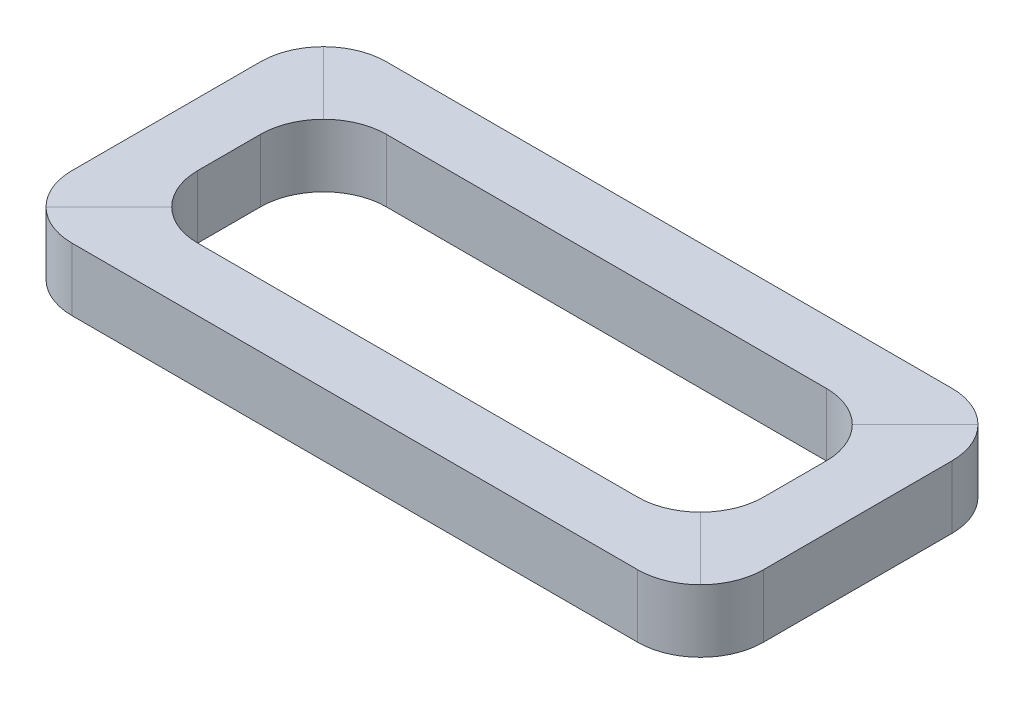
ISO-10303-21;
HEADER;
FILE_DESCRIPTION(('STEP AP214'),'2;1');
FILE_NAME('part.step','',(''),(''),'','','');
FILE_SCHEMA(('AUTOMOTIVE_DESIGN { 1 0 10303 214 1 1 1 1 }'));
ENDSEC;
DATA;
#1=APPLICATION_CONTEXT('core data for automotive mechanical design processes');
#2=APPLICATION_PROTOCOL_DEFINITION('international standard','automotive_design',2000,#1);
#3=PRODUCT_CONTEXT('',#1,'mechanical');
#4=PRODUCT('Part','Part','',(#3));
#5=PRODUCT_RELATED_PRODUCT_CATEGORY('part','',(#4));
#6=PRODUCT_DEFINITION_FORMATION('','',#4);
#7=PRODUCT_DEFINITION_CONTEXT('part definition',#1,'design');
#8=PRODUCT_DEFINITION('design','',#6,#7);
#9=PRODUCT_DEFINITION_SHAPE('','',#8);
#10=(LENGTH_UNIT() NAMED_UNIT(*) SI_UNIT(.MILLI.,.METRE.));
#11=(NAMED_UNIT(*) PLANE_ANGLE_UNIT() SI_UNIT($,.RADIAN.));
#12=(NAMED_UNIT(*) SI_UNIT($,.STERADIAN.) SOLID_ANGLE_UNIT());
#13=UNCERTAINTY_MEASURE_WITH_UNIT(LENGTH_MEASURE(1.E-05),#10,'distance_accuracy_value','');
#14=(GEOMETRIC_REPRESENTATION_CONTEXT(3) GLOBAL_UNCERTAINTY_ASSIGNED_CONTEXT((#13)) GLOBAL_UNIT_ASSIGNED_CONTEXT((#10,
#11,#12)) REPRESENTATION_CONTEXT('',''));
#15=CARTESIAN_POINT('',(0.,0.,0.));
#16=DIRECTION('',(0.,0.,1.));
#17=DIRECTION('',(1.,0.,0.));
#18=AXIS2_PLACEMENT_3D('',#15,#16,#17);
#19=CARTESIAN_POINT('',(52.85,2.5,22.5));
#20=DIRECTION('',(0.,1.,0.));
#21=DIRECTION('',(0.,0.,1.));
#22=AXIS2_PLACEMENT_3D('',#19,#20,#21);
#23=PLANE('',#22);
#24=DIRECTION('',(-0.707106781186547,0.,0.707106781186548));
#25=VECTOR('',#24,1.);
#26=CARTESIAN_POINT('',(-2.67499999999998,2.5,22.675));
#27=LINE('',#26,#25);
#28=CARTESIAN_POINT('',(3.96446609406728,2.5,16.0355339059327));
#29=VERTEX_POINT('',#28);
#30=CARTESIAN_POINT('',(-1.03553390593272,2.5,21.0355339059327));
#31=VERTEX_POINT('',#30);
#32=EDGE_CURVE('E302',#29,#31,#27,.T.);
#33=ORIENTED_EDGE('',*,*,#32,.T.);
#34=CARTESIAN_POINT('',(2.50000000000002,2.5,17.5));
#35=DIRECTION('',(0.,1.,0.));
#36=DIRECTION('',(0.,0.,1.));
#37=AXIS2_PLACEMENT_3D('',#34,#35,#36);
#38=CIRCLE('',#37,5.);
#39=CARTESIAN_POINT('',(2.50000000000002,2.5,22.5));
#40=VERTEX_POINT('',#39);
#41=EDGE_CURVE('E384',#31,#40,#38,.T.);
#42=ORIENTED_EDGE('',*,*,#41,.T.);
#43=DIRECTION('',(-1.,0.,0.));
#44=VECTOR('',#43,1.);
#45=CARTESIAN_POINT('',(52.85,2.5,22.5));
#46=LINE('',#45,#44);
#47=CARTESIAN_POINT('',(47.5,2.5,22.5));
#48=VERTEX_POINT('',#47);
#49=EDGE_CURVE('E310',#48,#40,#46,.T.);
#50=ORIENTED_EDGE('',*,*,#49,.F.);
#51=CARTESIAN_POINT('',(47.5,2.5,17.5));
#52=DIRECTION('',(0.,1.,0.));
#53=DIRECTION('',(0.,0.,1.));
#54=AXIS2_PLACEMENT_3D('',#51,#52,#53);
#55=CIRCLE('',#54,5.);
#56=CARTESIAN_POINT('',(51.0355339059327,2.5,21.0355339059327));
#57=VERTEX_POINT('',#56);
#58=EDGE_CURVE('E382',#48,#57,#55,.T.);
#59=ORIENTED_EDGE('',*,*,#58,.T.);
#60=DIRECTION('',(0.707106781186548,0.,0.707106781186548));
#61=VECTOR('',#60,1.);
#62=CARTESIAN_POINT('',(39.825,2.5,9.825));
#63=LINE('',#62,#61);
#64=CARTESIAN_POINT('',(46.0355339059327,2.5,16.0355339059327));
#65=VERTEX_POINT('',#64);
#66=EDGE_CURVE('E286',#65,#57,#63,.T.);
#67=ORIENTED_EDGE('',*,*,#66,.F.);
#68=CARTESIAN_POINT('',(42.5,2.5,12.5));
#69=DIRECTION('',(0.,1.,0.));
#70=DIRECTION('',(0.,0.,1.));
#71=AXIS2_PLACEMENT_3D('',#68,#69,#70);
#72=CIRCLE('',#71,5.);
#73=CARTESIAN_POINT('',(42.5,2.5,17.5));
#74=VERTEX_POINT('',#73);
#75=EDGE_CURVE('E238',#65,#74,#72,.F.);
#76=ORIENTED_EDGE('',*,*,#75,.T.);
#77=DIRECTION('',(-1.,0.,0.));
#78=VECTOR('',#77,1.);
#79=CARTESIAN_POINT('',(52.85,2.5,17.5));
#80=LINE('',#79,#78);
#81=CARTESIAN_POINT('',(7.50000000000002,2.5,17.5));
#82=VERTEX_POINT('',#81);
#83=EDGE_CURVE('E305',#74,#82,#80,.T.);
#84=ORIENTED_EDGE('',*,*,#83,.T.);
#85=CARTESIAN_POINT('',(7.50000000000002,2.5,12.5));
#86=DIRECTION('',(0.,1.,0.));
#87=DIRECTION('',(0.,0.,1.));
#88=AXIS2_PLACEMENT_3D('',#85,#86,#87);
#89=CIRCLE('',#88,5.);
#90=EDGE_CURVE('E232',#82,#29,#89,.F.);
#91=ORIENTED_EDGE('',*,*,#90,.T.);
#92=EDGE_LOOP('',(#33,#42,#50,#59,#67,#76,#84,#91));
#93=FACE_BOUND('',#92,.T.);
#94=ADVANCED_FACE('F39',(#93),#23,.T.);
#95=CARTESIAN_POINT('',(52.85,2.5,22.5));
#96=DIRECTION('',(0.,0.,1.));
#97=DIRECTION('',(1.,0.,0.));
#98=AXIS2_PLACEMENT_3D('',#95,#96,#97);
#99=PLANE('',#98);
#100=ORIENTED_EDGE('',*,*,#49,.T.);
#101=DIRECTION('',(0.,-1.,0.));
#102=VECTOR('',#101,1.);
#103=CARTESIAN_POINT('',(2.50000000000002,2.5,22.5));
#104=LINE('',#103,#102);
#105=CARTESIAN_POINT('',(2.50000000000002,-2.5,22.5));
#106=VERTEX_POINT('',#105);
#107=EDGE_CURVE('E375',#40,#106,#104,.T.);
#108=ORIENTED_EDGE('',*,*,#107,.T.);
#109=DIRECTION('',(-1.,0.,0.));
#110=VECTOR('',#109,1.);
#111=CARTESIAN_POINT('',(52.85,-2.5,22.5));
#112=LINE('',#111,#110);
#113=CARTESIAN_POINT('',(47.5,-2.5,22.5));
#114=VERTEX_POINT('',#113);
#115=EDGE_CURVE('E313',#114,#106,#112,.T.);
#116=ORIENTED_EDGE('',*,*,#115,.F.);
#117=DIRECTION('',(0.,-1.,0.));
#118=VECTOR('',#117,1.);
#119=CARTESIAN_POINT('',(47.5,2.5,22.5));
#120=LINE('',#119,#118);
#121=EDGE_CURVE('E373',#114,#48,#120,.F.);
#122=ORIENTED_EDGE('',*,*,#121,.T.);
#123=EDGE_LOOP('',(#100,#108,#116,#122));
#124=FACE_BOUND('',#123,.T.);
#125=ADVANCED_FACE('F410',(#124),#99,.T.);
#126=CARTESIAN_POINT('',(52.85,-2.5,22.5));
#127=DIRECTION('',(0.,-1.,0.));
#128=DIRECTION('',(0.,0.,-1.));
#129=AXIS2_PLACEMENT_3D('',#126,#127,#128);
#130=PLANE('',#129);
#131=ORIENTED_EDGE('',*,*,#115,.T.);
#132=CARTESIAN_POINT('',(2.50000000000002,-2.5,17.5));
#133=DIRECTION('',(0.,-1.,0.));
#134=DIRECTION('',(0.,0.,-1.));
#135=AXIS2_PLACEMENT_3D('',#132,#133,#134);
#136=CIRCLE('',#135,5.);
#137=CARTESIAN_POINT('',(-1.03553390593272,-2.5,21.0355339059327));
#138=VERTEX_POINT('',#137);
#139=EDGE_CURVE('E380',#106,#138,#136,.T.);
#140=ORIENTED_EDGE('',*,*,#139,.T.);
#141=DIRECTION('',(0.707106781186547,0.,-0.707106781186548));
#142=VECTOR('',#141,1.);
#143=CARTESIAN_POINT('',(-2.67499999999998,-2.5,22.675));
#144=LINE('',#143,#142);
#145=CARTESIAN_POINT('',(3.96446609406728,-2.5,16.0355339059327));
#146=VERTEX_POINT('',#145);
#147=EDGE_CURVE('E299',#138,#146,#144,.T.);
#148=ORIENTED_EDGE('',*,*,#147,.T.);
#149=CARTESIAN_POINT('',(7.50000000000002,-2.5,12.5));
#150=DIRECTION('',(0.,-1.,0.));
#151=DIRECTION('',(0.,0.,-1.));
#152=AXIS2_PLACEMENT_3D('',#149,#150,#151);
#153=CIRCLE('',#152,5.);
#154=CARTESIAN_POINT('',(7.50000000000002,-2.5,17.5));
#155=VERTEX_POINT('',#154);
#156=EDGE_CURVE('E227',#146,#155,#153,.F.);
#157=ORIENTED_EDGE('',*,*,#156,.T.);
#158=DIRECTION('',(-1.,0.,0.));
#159=VECTOR('',#158,1.);
#160=CARTESIAN_POINT('',(52.85,-2.5,17.5));
#161=LINE('',#160,#159);
#162=CARTESIAN_POINT('',(42.5,-2.5,17.5));
#163=VERTEX_POINT('',#162);
#164=EDGE_CURVE('E316',#163,#155,#161,.T.);
#165=ORIENTED_EDGE('',*,*,#164,.F.);
#166=CARTESIAN_POINT('',(42.5,-2.5,12.5));
#167=DIRECTION('',(0.,-1.,0.));
#168=DIRECTION('',(0.,0.,-1.));
#169=AXIS2_PLACEMENT_3D('',#166,#167,#168);
#170=CIRCLE('',#169,5.);
#171=CARTESIAN_POINT('',(46.0355339059327,-2.5,16.0355339059327));
#172=VERTEX_POINT('',#171);
#173=EDGE_CURVE('E240',#163,#172,#170,.F.);
#174=ORIENTED_EDGE('',*,*,#173,.T.);
#175=DIRECTION('',(-0.707106781186548,0.,-0.707106781186548));
#176=VECTOR('',#175,1.);
#177=CARTESIAN_POINT('',(39.825,-2.5,9.825));
#178=LINE('',#177,#176);
#179=CARTESIAN_POINT('',(51.0355339059327,-2.5,21.0355339059327));
#180=VERTEX_POINT('',#179);
#181=EDGE_CURVE('E283',#180,#172,#178,.T.);
#182=ORIENTED_EDGE('',*,*,#181,.F.);
#183=CARTESIAN_POINT('',(47.5,-2.5,17.5));
#184=DIRECTION('',(0.,-1.,0.));
#185=DIRECTION('',(0.,0.,-1.));
#186=AXIS2_PLACEMENT_3D('',#183,#184,#185);
#187=CIRCLE('',#186,5.);
#188=EDGE_CURVE('E378',#180,#114,#187,.T.);
#189=ORIENTED_EDGE('',*,*,#188,.T.);
#190=EDGE_LOOP('',(#131,#140,#148,#157,#165,#174,#182,#189));
#191=FACE_BOUND('',#190,.T.);
#192=ADVANCED_FACE('F430',(#191),#130,.T.);
#193=CARTESIAN_POINT('',(52.85,2.5,17.5));
#194=DIRECTION('',(0.,0.,-1.));
#195=DIRECTION('',(-1.,0.,0.));
#196=AXIS2_PLACEMENT_3D('',#193,#194,#195);
#197=PLANE('',#196);
#198=ORIENTED_EDGE('',*,*,#164,.T.);
#199=DIRECTION('',(0.,1.,0.));
#200=VECTOR('',#199,1.);
#201=CARTESIAN_POINT('',(7.50000000000002,2.5,17.5));
#202=LINE('',#201,#200);
#203=EDGE_CURVE('E326',#155,#82,#202,.T.);
#204=ORIENTED_EDGE('',*,*,#203,.T.);
#205=ORIENTED_EDGE('',*,*,#83,.F.);
#206=DIRECTION('',(0.,1.,0.));
#207=VECTOR('',#206,1.);
#208=CARTESIAN_POINT('',(42.5,-2.5,17.5));
#209=LINE('',#208,#207);
#210=EDGE_CURVE('E324',#74,#163,#209,.F.);
#211=ORIENTED_EDGE('',*,*,#210,.T.);
#212=EDGE_LOOP('',(#198,#204,#205,#211));
#213=FACE_BOUND('',#212,.T.);
#214=ADVANCED_FACE('F427',(#213),#197,.T.);
#215=CARTESIAN_POINT('',(-2.49999999999998,2.5,22.85));
#216=DIRECTION('',(0.,1.,0.));
#217=DIRECTION('',(0.,0.,1.));
#218=AXIS2_PLACEMENT_3D('',#215,#216,#217);
#219=PLANE('',#218);
#220=DIRECTION('',(-0.707106781186548,0.,-0.707106781186548));
#221=VECTOR('',#220,1.);
#222=CARTESIAN_POINT('',(-2.67499999999999,2.5,-2.67499999999999));
#223=LINE('',#222,#221);
#224=CARTESIAN_POINT('',(3.96446609406728,2.5,3.96446609406728));
#225=VERTEX_POINT('',#224);
#226=CARTESIAN_POINT('',(-1.03553390593273,2.5,-1.03553390593273));
#227=VERTEX_POINT('',#226);
#228=EDGE_CURVE('E285',#225,#227,#223,.T.);
#229=ORIENTED_EDGE('',*,*,#228,.T.);
#230=CARTESIAN_POINT('',(2.50000000000002,2.5,2.50000000000001));
#231=DIRECTION('',(0.,1.,0.));
#232=DIRECTION('',(0.,0.,1.));
#233=AXIS2_PLACEMENT_3D('',#230,#231,#232);
#234=CIRCLE('',#233,5.);
#235=CARTESIAN_POINT('',(-2.49999999999998,2.5,2.50000000000001));
#236=VERTEX_POINT('',#235);
#237=EDGE_CURVE('E358',#227,#236,#234,.T.);
#238=ORIENTED_EDGE('',*,*,#237,.T.);
#239=DIRECTION('',(0.,0.,-1.));
#240=VECTOR('',#239,1.);
#241=CARTESIAN_POINT('',(-2.49999999999998,2.5,22.85));
#242=LINE('',#241,#240);
#243=CARTESIAN_POINT('',(-2.49999999999998,2.5,17.5));
#244=VERTEX_POINT('',#243);
#245=EDGE_CURVE('E301',#244,#236,#242,.T.);
#246=ORIENTED_EDGE('',*,*,#245,.F.);
#247=CARTESIAN_POINT('',(2.50000000000002,2.5,17.5));
#248=DIRECTION('',(0.,1.,0.));
#249=DIRECTION('',(0.,0.,1.));
#250=AXIS2_PLACEMENT_3D('',#247,#248,#249);
#251=CIRCLE('',#250,5.);
#252=EDGE_CURVE('E356',#244,#31,#251,.T.);
#253=ORIENTED_EDGE('',*,*,#252,.T.);
#254=ORIENTED_EDGE('',*,*,#32,.F.);
#255=CARTESIAN_POINT('',(7.50000000000002,2.5,12.5));
#256=DIRECTION('',(0.,1.,0.));
#257=DIRECTION('',(0.,0.,1.));
#258=AXIS2_PLACEMENT_3D('',#255,#256,#257);
#259=CIRCLE('',#258,5.);
#260=CARTESIAN_POINT('',(2.50000000000002,2.5,12.5));
#261=VERTEX_POINT('',#260);
#262=EDGE_CURVE('E228',#29,#261,#259,.F.);
#263=ORIENTED_EDGE('',*,*,#262,.T.);
#264=DIRECTION('',(0.,0.,-1.));
#265=VECTOR('',#264,1.);
#266=CARTESIAN_POINT('',(2.50000000000002,2.5,22.85));
#267=LINE('',#266,#265);
#268=CARTESIAN_POINT('',(2.50000000000002,2.5,7.50000000000001));
#269=VERTEX_POINT('',#268);
#270=EDGE_CURVE('E207',#261,#269,#267,.T.);
#271=ORIENTED_EDGE('',*,*,#270,.T.);
#272=CARTESIAN_POINT('',(7.50000000000002,2.5,7.50000000000001));
#273=DIRECTION('',(0.,1.,0.));
#274=DIRECTION('',(0.,0.,1.));
#275=AXIS2_PLACEMENT_3D('',#272,#273,#274);
#276=CIRCLE('',#275,5.);
#277=EDGE_CURVE('E386',#269,#225,#276,.F.);
#278=ORIENTED_EDGE('',*,*,#277,.T.);
#279=EDGE_LOOP('',(#229,#238,#246,#253,#254,#263,#271,#278));
#280=FACE_BOUND('',#279,.T.);
#281=ADVANCED_FACE('F399',(#280),#219,.T.);
#282=CARTESIAN_POINT('',(-2.49999999999998,2.5,22.85));
#283=DIRECTION('',(-1.,0.,0.));
#284=DIRECTION('',(0.,0.,1.));
#285=AXIS2_PLACEMENT_3D('',#282,#283,#284);
#286=PLANE('',#285);
#287=ORIENTED_EDGE('',*,*,#245,.T.);
#288=DIRECTION('',(0.,-1.,0.));
#289=VECTOR('',#288,1.);
#290=CARTESIAN_POINT('',(-2.49999999999998,2.5,2.50000000000001));
#291=LINE('',#290,#289);
#292=CARTESIAN_POINT('',(-2.49999999999998,-2.5,2.50000000000001));
#293=VERTEX_POINT('',#292);
#294=EDGE_CURVE('E336',#236,#293,#291,.T.);
#295=ORIENTED_EDGE('',*,*,#294,.T.);
#296=DIRECTION('',(0.,0.,-1.));
#297=VECTOR('',#296,1.);
#298=CARTESIAN_POINT('',(-2.49999999999998,-2.5,22.85));
#299=LINE('',#298,#297);
#300=CARTESIAN_POINT('',(-2.49999999999998,-2.5,17.5));
#301=VERTEX_POINT('',#300);
#302=EDGE_CURVE('E223',#301,#293,#299,.T.);
#303=ORIENTED_EDGE('',*,*,#302,.F.);
#304=DIRECTION('',(0.,-1.,0.));
#305=VECTOR('',#304,1.);
#306=CARTESIAN_POINT('',(-2.49999999999998,2.5,17.5));
#307=LINE('',#306,#305);
#308=EDGE_CURVE('E334',#301,#244,#307,.F.);
#309=ORIENTED_EDGE('',*,*,#308,.T.);
#310=EDGE_LOOP('',(#287,#295,#303,#309));
#311=FACE_BOUND('',#310,.T.);
#312=ADVANCED_FACE('F462',(#311),#286,.T.);
#313=CARTESIAN_POINT('',(-2.49999999999998,-2.5,22.85));
#314=DIRECTION('',(0.,-1.,0.));
#315=DIRECTION('',(0.,0.,-1.));
#316=AXIS2_PLACEMENT_3D('',#313,#314,#315);
#317=PLANE('',#316);
#318=ORIENTED_EDGE('',*,*,#302,.T.);
#319=CARTESIAN_POINT('',(2.50000000000002,-2.5,2.50000000000001));
#320=DIRECTION('',(0.,-1.,0.));
#321=DIRECTION('',(0.,0.,-1.));
#322=AXIS2_PLACEMENT_3D('',#319,#320,#321);
#323=CIRCLE('',#322,5.);
#324=CARTESIAN_POINT('',(-1.03553390593273,-2.5,-1.03553390593273));
#325=VERTEX_POINT('',#324);
#326=EDGE_CURVE('E341',#293,#325,#323,.T.);
#327=ORIENTED_EDGE('',*,*,#326,.T.);
#328=DIRECTION('',(0.707106781186548,0.,0.707106781186548));
#329=VECTOR('',#328,1.);
#330=CARTESIAN_POINT('',(-2.67499999999999,-2.5,-2.67499999999999));
#331=LINE('',#330,#329);
#332=CARTESIAN_POINT('',(3.96446609406728,-2.5,3.96446609406728));
#333=VERTEX_POINT('',#332);
#334=EDGE_CURVE('E443',#325,#333,#331,.T.);
#335=ORIENTED_EDGE('',*,*,#334,.T.);
#336=CARTESIAN_POINT('',(7.50000000000002,-2.5,7.50000000000001));
#337=DIRECTION('',(0.,-1.,0.));
#338=DIRECTION('',(0.,0.,-1.));
#339=AXIS2_PLACEMENT_3D('',#336,#337,#338);
#340=CIRCLE('',#339,5.);
#341=CARTESIAN_POINT('',(2.50000000000002,-2.5,7.50000000000001));
#342=VERTEX_POINT('',#341);
#343=EDGE_CURVE('E222',#333,#342,#340,.F.);
#344=ORIENTED_EDGE('',*,*,#343,.T.);
#345=DIRECTION('',(0.,0.,-1.));
#346=VECTOR('',#345,1.);
#347=CARTESIAN_POINT('',(2.50000000000002,-2.5,22.85));
#348=LINE('',#347,#346);
#349=CARTESIAN_POINT('',(2.50000000000002,-2.5,12.5));
#350=VERTEX_POINT('',#349);
#351=EDGE_CURVE('E204',#350,#342,#348,.T.);
#352=ORIENTED_EDGE('',*,*,#351,.F.);
#353=CARTESIAN_POINT('',(7.50000000000002,-2.5,12.5));
#354=DIRECTION('',(0.,-1.,0.));
#355=DIRECTION('',(0.,0.,-1.));
#356=AXIS2_PLACEMENT_3D('',#353,#354,#355);
#357=CIRCLE('',#356,5.);
#358=EDGE_CURVE('E219',#350,#146,#357,.F.);
#359=ORIENTED_EDGE('',*,*,#358,.T.);
#360=ORIENTED_EDGE('',*,*,#147,.F.);
#361=CARTESIAN_POINT('',(2.50000000000002,-2.5,17.5));
#362=DIRECTION('',(0.,-1.,0.));
#363=DIRECTION('',(0.,0.,-1.));
#364=AXIS2_PLACEMENT_3D('',#361,#362,#363);
#365=CIRCLE('',#364,5.);
#366=EDGE_CURVE('E339',#138,#301,#365,.T.);
#367=ORIENTED_EDGE('',*,*,#366,.T.);
#368=EDGE_LOOP('',(#318,#327,#335,#344,#352,#359,#360,#367));
#369=FACE_BOUND('',#368,.T.);
#370=ADVANCED_FACE('F217',(#369),#317,.T.);
#371=CARTESIAN_POINT('',(2.50000000000002,2.5,22.85));
#372=DIRECTION('',(1.,0.,0.));
#373=DIRECTION('',(0.,0.,-1.));
#374=AXIS2_PLACEMENT_3D('',#371,#372,#373);
#375=PLANE('',#374);
#376=ORIENTED_EDGE('',*,*,#351,.T.);
#377=DIRECTION('',(0.,1.,0.));
#378=VECTOR('',#377,1.);
#379=CARTESIAN_POINT('',(2.50000000000002,2.5,7.50000000000001));
#380=LINE('',#379,#378);
#381=EDGE_CURVE('E211',#342,#269,#380,.T.);
#382=ORIENTED_EDGE('',*,*,#381,.T.);
#383=ORIENTED_EDGE('',*,*,#270,.F.);
#384=DIRECTION('',(0.,1.,0.));
#385=VECTOR('',#384,1.);
#386=CARTESIAN_POINT('',(2.50000000000002,-2.5,12.5));
#387=LINE('',#386,#385);
#388=EDGE_CURVE('E200',#261,#350,#387,.F.);
#389=ORIENTED_EDGE('',*,*,#388,.T.);
#390=EDGE_LOOP('',(#376,#382,#383,#389));
#391=FACE_BOUND('',#390,.T.);
#392=ADVANCED_FACE('F202',(#391),#375,.T.);
#393=CARTESIAN_POINT('',(52.5,2.5,-2.84999999999999));
#394=DIRECTION('',(0.,1.,0.));
#395=DIRECTION('',(0.,0.,1.));
#396=AXIS2_PLACEMENT_3D('',#393,#394,#395);
#397=PLANE('',#396);
#398=DIRECTION('',(0.,0.,1.));
#399=VECTOR('',#398,1.);
#400=CARTESIAN_POINT('',(52.5,2.5,-2.84999999999999));
#401=LINE('',#400,#399);
#402=CARTESIAN_POINT('',(52.5,2.5,2.5));
#403=VERTEX_POINT('',#402);
#404=CARTESIAN_POINT('',(52.5,2.5,17.5));
#405=VERTEX_POINT('',#404);
#406=EDGE_CURVE('E290',#403,#405,#401,.T.);
#407=ORIENTED_EDGE('',*,*,#406,.F.);
#408=CARTESIAN_POINT('',(47.5,2.5,2.5));
#409=DIRECTION('',(0.,1.,0.));
#410=DIRECTION('',(0.,0.,1.));
#411=AXIS2_PLACEMENT_3D('',#408,#409,#410);
#412=CIRCLE('',#411,5.);
#413=CARTESIAN_POINT('',(51.0355339059327,2.5,-1.03553390593274));
#414=VERTEX_POINT('',#413);
#415=EDGE_CURVE('E371',#403,#414,#412,.T.);
#416=ORIENTED_EDGE('',*,*,#415,.T.);
#417=DIRECTION('',(0.707106781186548,0.,-0.707106781186548));
#418=VECTOR('',#417,1.);
#419=CARTESIAN_POINT('',(24.825,2.5,25.175));
#420=LINE('',#419,#418);
#421=CARTESIAN_POINT('',(46.0355339059327,2.5,3.96446609406726));
#422=VERTEX_POINT('',#421);
#423=EDGE_CURVE('E61',#422,#414,#420,.T.);
#424=ORIENTED_EDGE('',*,*,#423,.F.);
#425=CARTESIAN_POINT('',(42.5,2.5,7.50000000000001));
#426=DIRECTION('',(0.,1.,0.));
#427=DIRECTION('',(0.,0.,1.));
#428=AXIS2_PLACEMENT_3D('',#425,#426,#427);
#429=CIRCLE('',#428,5.);
#430=CARTESIAN_POINT('',(47.5,2.5,7.50000000000001));
#431=VERTEX_POINT('',#430);
#432=EDGE_CURVE('E247',#422,#431,#429,.F.);
#433=ORIENTED_EDGE('',*,*,#432,.T.);
#434=DIRECTION('',(0.,0.,1.));
#435=VECTOR('',#434,1.);
#436=CARTESIAN_POINT('',(47.5,2.5,-2.84999999999999));
#437=LINE('',#436,#435);
#438=CARTESIAN_POINT('',(47.5,2.5,12.5));
#439=VERTEX_POINT('',#438);
#440=EDGE_CURVE('E289',#431,#439,#437,.T.);
#441=ORIENTED_EDGE('',*,*,#440,.T.);
#442=CARTESIAN_POINT('',(42.5,2.5,12.5));
#443=DIRECTION('',(0.,1.,0.));
#444=DIRECTION('',(0.,0.,1.));
#445=AXIS2_PLACEMENT_3D('',#442,#443,#444);
#446=CIRCLE('',#445,5.);
#447=EDGE_CURVE('E230',#439,#65,#446,.F.);
#448=ORIENTED_EDGE('',*,*,#447,.T.);
#449=ORIENTED_EDGE('',*,*,#66,.T.);
#450=CARTESIAN_POINT('',(47.5,2.5,17.5));
#451=DIRECTION('',(0.,1.,0.));
#452=DIRECTION('',(0.,0.,1.));
#453=AXIS2_PLACEMENT_3D('',#450,#451,#452);
#454=CIRCLE('',#453,5.);
#455=EDGE_CURVE('E369',#57,#405,#454,.T.);
#456=ORIENTED_EDGE('',*,*,#455,.T.);
#457=EDGE_LOOP('',(#407,#416,#424,#433,#441,#448,#449,#456));
#458=FACE_BOUND('',#457,.T.);
#459=ADVANCED_FACE('F418',(#458),#397,.T.);
#460=CARTESIAN_POINT('',(52.5,2.5,-2.84999999999999));
#461=DIRECTION('',(1.,0.,0.));
#462=DIRECTION('',(0.,0.,-1.));
#463=AXIS2_PLACEMENT_3D('',#460,#461,#462);
#464=PLANE('',#463);
#465=DIRECTION('',(0.,0.,1.));
#466=VECTOR('',#465,1.);
#467=CARTESIAN_POINT('',(52.5,-2.5,-2.84999999999999));
#468=LINE('',#467,#466);
#469=CARTESIAN_POINT('',(52.5,-2.5,2.5));
#470=VERTEX_POINT('',#469);
#471=CARTESIAN_POINT('',(52.5,-2.5,17.5));
#472=VERTEX_POINT('',#471);
#473=EDGE_CURVE('E293',#470,#472,#468,.T.);
#474=ORIENTED_EDGE('',*,*,#473,.F.);
#475=DIRECTION('',(0.,-1.,0.));
#476=VECTOR('',#475,1.);
#477=CARTESIAN_POINT('',(52.5,2.5,2.5));
#478=LINE('',#477,#476);
#479=EDGE_CURVE('E367',#470,#403,#478,.F.);
#480=ORIENTED_EDGE('',*,*,#479,.T.);
#481=ORIENTED_EDGE('',*,*,#406,.T.);
#482=DIRECTION('',(0.,-1.,0.));
#483=VECTOR('',#482,1.);
#484=CARTESIAN_POINT('',(52.5,2.5,17.5));
#485=LINE('',#484,#483);
#486=EDGE_CURVE('E364',#405,#472,#485,.T.);
#487=ORIENTED_EDGE('',*,*,#486,.T.);
#488=EDGE_LOOP('',(#474,#480,#481,#487));
#489=FACE_BOUND('',#488,.T.);
#490=ADVANCED_FACE('F485',(#489),#464,.T.);
#491=CARTESIAN_POINT('',(52.5,-2.5,-2.84999999999999));
#492=DIRECTION('',(0.,-1.,0.));
#493=DIRECTION('',(0.,0.,-1.));
#494=AXIS2_PLACEMENT_3D('',#491,#492,#493);
#495=PLANE('',#494);
#496=DIRECTION('',(-0.707106781186548,0.,0.707106781186548));
#497=VECTOR('',#496,1.);
#498=CARTESIAN_POINT('',(24.825,-2.5,25.175));
#499=LINE('',#498,#497);
#500=CARTESIAN_POINT('',(51.0355339059327,-2.5,-1.03553390593274));
#501=VERTEX_POINT('',#500);
#502=CARTESIAN_POINT('',(46.0355339059327,-2.5,3.96446609406726));
#503=VERTEX_POINT('',#502);
#504=EDGE_CURVE('E53',#501,#503,#499,.T.);
#505=ORIENTED_EDGE('',*,*,#504,.F.);
#506=CARTESIAN_POINT('',(47.5,-2.5,2.5));
#507=DIRECTION('',(0.,-1.,0.));
#508=DIRECTION('',(0.,0.,-1.));
#509=AXIS2_PLACEMENT_3D('',#506,#507,#508);
#510=CIRCLE('',#509,5.);
#511=EDGE_CURVE('E362',#501,#470,#510,.T.);
#512=ORIENTED_EDGE('',*,*,#511,.T.);
#513=ORIENTED_EDGE('',*,*,#473,.T.);
#514=CARTESIAN_POINT('',(47.5,-2.5,17.5));
#515=DIRECTION('',(0.,-1.,0.));
#516=DIRECTION('',(0.,0.,-1.));
#517=AXIS2_PLACEMENT_3D('',#514,#515,#516);
#518=CIRCLE('',#517,5.);
#519=EDGE_CURVE('E360',#472,#180,#518,.T.);
#520=ORIENTED_EDGE('',*,*,#519,.T.);
#521=ORIENTED_EDGE('',*,*,#181,.T.);
#522=CARTESIAN_POINT('',(42.5,-2.5,12.5));
#523=DIRECTION('',(0.,-1.,0.));
#524=DIRECTION('',(0.,0.,-1.));
#525=AXIS2_PLACEMENT_3D('',#522,#523,#524);
#526=CIRCLE('',#525,5.);
#527=CARTESIAN_POINT('',(47.5,-2.5,12.5));
#528=VERTEX_POINT('',#527);
#529=EDGE_CURVE('E243',#172,#528,#526,.F.);
#530=ORIENTED_EDGE('',*,*,#529,.T.);
#531=DIRECTION('',(0.,0.,1.));
#532=VECTOR('',#531,1.);
#533=CARTESIAN_POINT('',(47.5,-2.5,-2.84999999999999));
#534=LINE('',#533,#532);
#535=CARTESIAN_POINT('',(47.5,-2.5,7.50000000000001));
#536=VERTEX_POINT('',#535);
#537=EDGE_CURVE('E255',#536,#528,#534,.T.);
#538=ORIENTED_EDGE('',*,*,#537,.F.);
#539=CARTESIAN_POINT('',(42.5,-2.5,7.50000000000001));
#540=DIRECTION('',(0.,-1.,0.));
#541=DIRECTION('',(0.,0.,-1.));
#542=AXIS2_PLACEMENT_3D('',#539,#540,#541);
#543=CIRCLE('',#542,5.);
#544=EDGE_CURVE('E47',#536,#503,#543,.F.);
#545=ORIENTED_EDGE('',*,*,#544,.T.);
#546=EDGE_LOOP('',(#505,#512,#513,#520,#521,#530,#538,#545));
#547=FACE_BOUND('',#546,.T.);
#548=ADVANCED_FACE('F252',(#547),#495,.T.);
#549=CARTESIAN_POINT('',(47.5,2.5,-2.84999999999999));
#550=DIRECTION('',(-1.,0.,0.));
#551=DIRECTION('',(0.,0.,1.));
#552=AXIS2_PLACEMENT_3D('',#549,#550,#551);
#553=PLANE('',#552);
#554=ORIENTED_EDGE('',*,*,#537,.T.);
#555=DIRECTION('',(0.,1.,0.));
#556=VECTOR('',#555,1.);
#557=CARTESIAN_POINT('',(47.5,2.5,12.5));
#558=LINE('',#557,#556);
#559=EDGE_CURVE('E331',#528,#439,#558,.T.);
#560=ORIENTED_EDGE('',*,*,#559,.T.);
#561=ORIENTED_EDGE('',*,*,#440,.F.);
#562=DIRECTION('',(0.,1.,0.));
#563=VECTOR('',#562,1.);
#564=CARTESIAN_POINT('',(47.5,-2.5,7.50000000000001));
#565=LINE('',#564,#563);
#566=EDGE_CURVE('E329',#431,#536,#565,.F.);
#567=ORIENTED_EDGE('',*,*,#566,.T.);
#568=EDGE_LOOP('',(#554,#560,#561,#567));
#569=FACE_BOUND('',#568,.T.);
#570=ADVANCED_FACE('F434',(#569),#553,.T.);
#571=CARTESIAN_POINT('',(-2.84999999999999,2.5,-2.5));
#572=DIRECTION('',(0.,1.,0.));
#573=DIRECTION('',(0.,0.,1.));
#574=AXIS2_PLACEMENT_3D('',#571,#572,#573);
#575=PLANE('',#574);
#576=DIRECTION('',(1.,0.,0.));
#577=VECTOR('',#576,1.);
#578=CARTESIAN_POINT('',(-2.84999999999999,2.5,-2.5));
#579=LINE('',#578,#577);
#580=CARTESIAN_POINT('',(2.50000000000002,2.5,-2.5));
#581=VERTEX_POINT('',#580);
#582=CARTESIAN_POINT('',(47.5,2.5,-2.5));
#583=VERTEX_POINT('',#582);
#584=EDGE_CURVE('E279',#581,#583,#579,.T.);
#585=ORIENTED_EDGE('',*,*,#584,.F.);
#586=CARTESIAN_POINT('',(2.50000000000002,2.5,2.50000000000001));
#587=DIRECTION('',(0.,1.,0.));
#588=DIRECTION('',(0.,0.,1.));
#589=AXIS2_PLACEMENT_3D('',#586,#587,#588);
#590=CIRCLE('',#589,5.);
#591=EDGE_CURVE('E354',#581,#227,#590,.T.);
#592=ORIENTED_EDGE('',*,*,#591,.T.);
#593=ORIENTED_EDGE('',*,*,#228,.F.);
#594=CARTESIAN_POINT('',(7.50000000000002,2.5,7.50000000000001));
#595=DIRECTION('',(0.,1.,0.));
#596=DIRECTION('',(0.,0.,1.));
#597=AXIS2_PLACEMENT_3D('',#594,#595,#596);
#598=CIRCLE('',#597,5.);
#599=CARTESIAN_POINT('',(7.50000000000002,2.5,2.50000000000001));
#600=VERTEX_POINT('',#599);
#601=EDGE_CURVE('E389',#225,#600,#598,.F.);
#602=ORIENTED_EDGE('',*,*,#601,.T.);
#603=DIRECTION('',(1.,0.,0.));
#604=VECTOR('',#603,1.);
#605=CARTESIAN_POINT('',(-2.84999999999999,2.5,2.50000000000001));
#606=LINE('',#605,#604);
#607=CARTESIAN_POINT('',(42.5,2.5,2.50000000000001));
#608=VERTEX_POINT('',#607);
#609=EDGE_CURVE('E212',#600,#608,#606,.T.);
#610=ORIENTED_EDGE('',*,*,#609,.T.);
#611=CARTESIAN_POINT('',(42.5,2.5,7.50000000000001));
#612=DIRECTION('',(0.,1.,0.));
#613=DIRECTION('',(0.,0.,1.));
#614=AXIS2_PLACEMENT_3D('',#611,#612,#613);
#615=CIRCLE('',#614,5.);
#616=EDGE_CURVE('E245',#608,#422,#615,.F.);
#617=ORIENTED_EDGE('',*,*,#616,.T.);
#618=ORIENTED_EDGE('',*,*,#423,.T.);
#619=CARTESIAN_POINT('',(47.5,2.5,2.5));
#620=DIRECTION('',(0.,1.,0.));
#621=DIRECTION('',(0.,0.,1.));
#622=AXIS2_PLACEMENT_3D('',#619,#620,#621);
#623=CIRCLE('',#622,5.);
#624=EDGE_CURVE('E352',#414,#583,#623,.T.);
#625=ORIENTED_EDGE('',*,*,#624,.T.);
#626=EDGE_LOOP('',(#585,#592,#593,#602,#610,#617,#618,#625));
#627=FACE_BOUND('',#626,.T.);
#628=ADVANCED_FACE('F438',(#627),#575,.T.);
#629=CARTESIAN_POINT('',(-2.84999999999999,2.5,-2.5));
#630=DIRECTION('',(0.,0.,-1.));
#631=DIRECTION('',(-1.,0.,0.));
#632=AXIS2_PLACEMENT_3D('',#629,#630,#631);
#633=PLANE('',#632);
#634=DIRECTION('',(1.,0.,0.));
#635=VECTOR('',#634,1.);
#636=CARTESIAN_POINT('',(-2.84999999999999,-2.5,-2.5));
#637=LINE('',#636,#635);
#638=CARTESIAN_POINT('',(2.50000000000002,-2.5,-2.5));
#639=VERTEX_POINT('',#638);
#640=CARTESIAN_POINT('',(47.5,-2.5,-2.5));
#641=VERTEX_POINT('',#640);
#642=EDGE_CURVE('E275',#639,#641,#637,.T.);
#643=ORIENTED_EDGE('',*,*,#642,.F.);
#644=DIRECTION('',(0.,-1.,0.));
#645=VECTOR('',#644,1.);
#646=CARTESIAN_POINT('',(2.50000000000002,2.5,-2.5));
#647=LINE('',#646,#645);
#648=EDGE_CURVE('E350',#639,#581,#647,.F.);
#649=ORIENTED_EDGE('',*,*,#648,.T.);
#650=ORIENTED_EDGE('',*,*,#584,.T.);
#651=DIRECTION('',(0.,-1.,0.));
#652=VECTOR('',#651,1.);
#653=CARTESIAN_POINT('',(47.5,2.5,-2.5));
#654=LINE('',#653,#652);
#655=EDGE_CURVE('E347',#583,#641,#654,.T.);
#656=ORIENTED_EDGE('',*,*,#655,.T.);
#657=EDGE_LOOP('',(#643,#649,#650,#656));
#658=FACE_BOUND('',#657,.T.);
#659=ADVANCED_FACE('F455',(#658),#633,.T.);
#660=CARTESIAN_POINT('',(-2.84999999999999,-2.5,-2.5));
#661=DIRECTION('',(0.,-1.,0.));
#662=DIRECTION('',(0.,0.,-1.));
#663=AXIS2_PLACEMENT_3D('',#660,#661,#662);
#664=PLANE('',#663);
#665=ORIENTED_EDGE('',*,*,#334,.F.);
#666=CARTESIAN_POINT('',(2.50000000000002,-2.5,2.50000000000001));
#667=DIRECTION('',(0.,-1.,0.));
#668=DIRECTION('',(0.,0.,-1.));
#669=AXIS2_PLACEMENT_3D('',#666,#667,#668);
#670=CIRCLE('',#669,5.);
#671=EDGE_CURVE('E345',#325,#639,#670,.T.);
#672=ORIENTED_EDGE('',*,*,#671,.T.);
#673=ORIENTED_EDGE('',*,*,#642,.T.);
#674=CARTESIAN_POINT('',(47.5,-2.5,2.5));
#675=DIRECTION('',(0.,-1.,0.));
#676=DIRECTION('',(0.,0.,-1.));
#677=AXIS2_PLACEMENT_3D('',#674,#675,#676);
#678=CIRCLE('',#677,5.);
#679=EDGE_CURVE('E343',#641,#501,#678,.T.);
#680=ORIENTED_EDGE('',*,*,#679,.T.);
#681=ORIENTED_EDGE('',*,*,#504,.T.);
#682=CARTESIAN_POINT('',(42.5,-2.5,7.50000000000001));
#683=DIRECTION('',(0.,-1.,0.));
#684=DIRECTION('',(0.,0.,-1.));
#685=AXIS2_PLACEMENT_3D('',#682,#683,#684);
#686=CIRCLE('',#685,5.);
#687=CARTESIAN_POINT('',(42.5,-2.5,2.50000000000001));
#688=VERTEX_POINT('',#687);
#689=EDGE_CURVE('E11',#503,#688,#686,.F.);
#690=ORIENTED_EDGE('',*,*,#689,.T.);
#691=DIRECTION('',(1.,0.,0.));
#692=VECTOR('',#691,1.);
#693=CARTESIAN_POINT('',(-2.84999999999999,-2.5,2.50000000000001));
#694=LINE('',#693,#692);
#695=CARTESIAN_POINT('',(7.50000000000002,-2.5,2.50000000000001));
#696=VERTEX_POINT('',#695);
#697=EDGE_CURVE('E267',#696,#688,#694,.T.);
#698=ORIENTED_EDGE('',*,*,#697,.F.);
#699=CARTESIAN_POINT('',(7.50000000000002,-2.5,7.50000000000001));
#700=DIRECTION('',(0.,-1.,0.));
#701=DIRECTION('',(0.,0.,-1.));
#702=AXIS2_PLACEMENT_3D('',#699,#700,#701);
#703=CIRCLE('',#702,5.);
#704=EDGE_CURVE('E391',#696,#333,#703,.F.);
#705=ORIENTED_EDGE('',*,*,#704,.T.);
#706=EDGE_LOOP('',(#665,#672,#673,#680,#681,#690,#698,#705));
#707=FACE_BOUND('',#706,.T.);
#708=ADVANCED_FACE('F265',(#707),#664,.T.);
#709=CARTESIAN_POINT('',(-2.84999999999999,2.5,2.50000000000001));
#710=DIRECTION('',(0.,0.,1.));
#711=DIRECTION('',(1.,0.,0.));
#712=AXIS2_PLACEMENT_3D('',#709,#710,#711);
#713=PLANE('',#712);
#714=ORIENTED_EDGE('',*,*,#609,.F.);
#715=DIRECTION('',(0.,1.,0.));
#716=VECTOR('',#715,1.);
#717=CARTESIAN_POINT('',(7.50000000000002,-2.5,2.50000000000001));
#718=LINE('',#717,#716);
#719=EDGE_CURVE('E274',#600,#696,#718,.F.);
#720=ORIENTED_EDGE('',*,*,#719,.T.);
#721=ORIENTED_EDGE('',*,*,#697,.T.);
#722=DIRECTION('',(0.,1.,0.));
#723=VECTOR('',#722,1.);
#724=CARTESIAN_POINT('',(42.5,2.5,2.50000000000001));
#725=LINE('',#724,#723);
#726=EDGE_CURVE('E261',#688,#608,#725,.T.);
#727=ORIENTED_EDGE('',*,*,#726,.T.);
#728=EDGE_LOOP('',(#714,#720,#721,#727));
#729=FACE_BOUND('',#728,.T.);
#730=ADVANCED_FACE('F271',(#729),#713,.T.);
#731=CARTESIAN_POINT('',(7.50000000000002,2.5,7.50000000000001));
#732=DIRECTION('',(0.,-1.,0.));
#733=DIRECTION('',(0.,0.,-1.));
#734=AXIS2_PLACEMENT_3D('',#731,#732,#733);
#735=CYLINDRICAL_SURFACE('',#734,5.);
#736=ORIENTED_EDGE('',*,*,#704,.F.);
#737=ORIENTED_EDGE('',*,*,#719,.F.);
#738=ORIENTED_EDGE('',*,*,#601,.F.);
#739=ORIENTED_EDGE('',*,*,#277,.F.);
#740=ORIENTED_EDGE('',*,*,#381,.F.);
#741=ORIENTED_EDGE('',*,*,#343,.F.);
#742=EDGE_LOOP('',(#736,#737,#738,#739,#740,#741));
#743=FACE_BOUND('',#742,.T.);
#744=ADVANCED_FACE('F442',(#743),#735,.F.);
#745=CARTESIAN_POINT('',(7.50000000000002,2.5,12.5));
#746=DIRECTION('',(0.,-1.,0.));
#747=DIRECTION('',(0.,0.,-1.));
#748=AXIS2_PLACEMENT_3D('',#745,#746,#747);
#749=CYLINDRICAL_SURFACE('',#748,5.);
#750=ORIENTED_EDGE('',*,*,#358,.F.);
#751=ORIENTED_EDGE('',*,*,#388,.F.);
#752=ORIENTED_EDGE('',*,*,#262,.F.);
#753=ORIENTED_EDGE('',*,*,#90,.F.);
#754=ORIENTED_EDGE('',*,*,#203,.F.);
#755=ORIENTED_EDGE('',*,*,#156,.F.);
#756=EDGE_LOOP('',(#750,#751,#752,#753,#754,#755));
#757=FACE_BOUND('',#756,.T.);
#758=ADVANCED_FACE('F225',(#757),#749,.F.);
#759=CARTESIAN_POINT('',(42.5,2.5,12.5));
#760=DIRECTION('',(0.,-1.,0.));
#761=DIRECTION('',(0.,0.,-1.));
#762=AXIS2_PLACEMENT_3D('',#759,#760,#761);
#763=CYLINDRICAL_SURFACE('',#762,5.);
#764=ORIENTED_EDGE('',*,*,#173,.F.);
#765=ORIENTED_EDGE('',*,*,#210,.F.);
#766=ORIENTED_EDGE('',*,*,#75,.F.);
#767=ORIENTED_EDGE('',*,*,#447,.F.);
#768=ORIENTED_EDGE('',*,*,#559,.F.);
#769=ORIENTED_EDGE('',*,*,#529,.F.);
#770=EDGE_LOOP('',(#764,#765,#766,#767,#768,#769));
#771=FACE_BOUND('',#770,.T.);
#772=ADVANCED_FACE('F425',(#771),#763,.F.);
#773=CARTESIAN_POINT('',(42.5,2.5,7.50000000000001));
#774=DIRECTION('',(0.,-1.,0.));
#775=DIRECTION('',(0.,0.,-1.));
#776=AXIS2_PLACEMENT_3D('',#773,#774,#775);
#777=CYLINDRICAL_SURFACE('',#776,5.);
#778=ORIENTED_EDGE('',*,*,#544,.F.);
#779=ORIENTED_EDGE('',*,*,#566,.F.);
#780=ORIENTED_EDGE('',*,*,#432,.F.);
#781=ORIENTED_EDGE('',*,*,#616,.F.);
#782=ORIENTED_EDGE('',*,*,#726,.F.);
#783=ORIENTED_EDGE('',*,*,#689,.F.);
#784=EDGE_LOOP('',(#778,#779,#780,#781,#782,#783));
#785=FACE_BOUND('',#784,.T.);
#786=ADVANCED_FACE('F259',(#785),#777,.F.);
#787=CARTESIAN_POINT('',(2.50000000000002,2.5,2.50000000000001));
#788=DIRECTION('',(0.,-1.,0.));
#789=DIRECTION('',(0.,0.,-1.));
#790=AXIS2_PLACEMENT_3D('',#787,#788,#789);
#791=CYLINDRICAL_SURFACE('',#790,5.);
#792=ORIENTED_EDGE('',*,*,#591,.F.);
#793=ORIENTED_EDGE('',*,*,#648,.F.);
#794=ORIENTED_EDGE('',*,*,#671,.F.);
#795=ORIENTED_EDGE('',*,*,#326,.F.);
#796=ORIENTED_EDGE('',*,*,#294,.F.);
#797=ORIENTED_EDGE('',*,*,#237,.F.);
#798=EDGE_LOOP('',(#792,#793,#794,#795,#796,#797));
#799=FACE_BOUND('',#798,.T.);
#800=ADVANCED_FACE('F450',(#799),#791,.T.);
#801=CARTESIAN_POINT('',(47.5,2.5,2.5));
#802=DIRECTION('',(0.,-1.,0.));
#803=DIRECTION('',(0.,0.,-1.));
#804=AXIS2_PLACEMENT_3D('',#801,#802,#803);
#805=CYLINDRICAL_SURFACE('',#804,5.);
#806=ORIENTED_EDGE('',*,*,#415,.F.);
#807=ORIENTED_EDGE('',*,*,#479,.F.);
#808=ORIENTED_EDGE('',*,*,#511,.F.);
#809=ORIENTED_EDGE('',*,*,#679,.F.);
#810=ORIENTED_EDGE('',*,*,#655,.F.);
#811=ORIENTED_EDGE('',*,*,#624,.F.);
#812=EDGE_LOOP('',(#806,#807,#808,#809,#810,#811));
#813=FACE_BOUND('',#812,.T.);
#814=ADVANCED_FACE('F570',(#813),#805,.T.);
#815=CARTESIAN_POINT('',(2.50000000000002,2.5,17.5));
#816=DIRECTION('',(0.,-1.,0.));
#817=DIRECTION('',(0.,0.,-1.));
#818=AXIS2_PLACEMENT_3D('',#815,#816,#817);
#819=CYLINDRICAL_SURFACE('',#818,5.);
#820=ORIENTED_EDGE('',*,*,#252,.F.);
#821=ORIENTED_EDGE('',*,*,#308,.F.);
#822=ORIENTED_EDGE('',*,*,#366,.F.);
#823=ORIENTED_EDGE('',*,*,#139,.F.);
#824=ORIENTED_EDGE('',*,*,#107,.F.);
#825=ORIENTED_EDGE('',*,*,#41,.F.);
#826=EDGE_LOOP('',(#820,#821,#822,#823,#824,#825));
#827=FACE_BOUND('',#826,.T.);
#828=ADVANCED_FACE('F404',(#827),#819,.T.);
#829=CARTESIAN_POINT('',(47.5,2.5,17.5));
#830=DIRECTION('',(0.,-1.,0.));
#831=DIRECTION('',(0.,0.,-1.));
#832=AXIS2_PLACEMENT_3D('',#829,#830,#831);
#833=CYLINDRICAL_SURFACE('',#832,5.);
#834=ORIENTED_EDGE('',*,*,#58,.F.);
#835=ORIENTED_EDGE('',*,*,#121,.F.);
#836=ORIENTED_EDGE('',*,*,#188,.F.);
#837=ORIENTED_EDGE('',*,*,#519,.F.);
#838=ORIENTED_EDGE('',*,*,#486,.F.);
#839=ORIENTED_EDGE('',*,*,#455,.F.);
#840=EDGE_LOOP('',(#834,#835,#836,#837,#838,#839));
#841=FACE_BOUND('',#840,.T.);
#842=ADVANCED_FACE('F41',(#841),#833,.T.);
#843=CLOSED_SHELL('',(#94,#125,#192,#214,#281,#312,#370,#392,#459,#490,#548,#570,#628,#659,#708,
#730,#744,#758,#772,#786,#800,#814,#828,#842));
#844=MANIFOLD_SOLID_BREP('B2',#843);
#845=ADVANCED_BREP_SHAPE_REPRESENTATION('',(#18,#844),#14);
#846=SHAPE_DEFINITION_REPRESENTATION(#9,#845);
ENDSEC;
END-ISO-10303-21;
